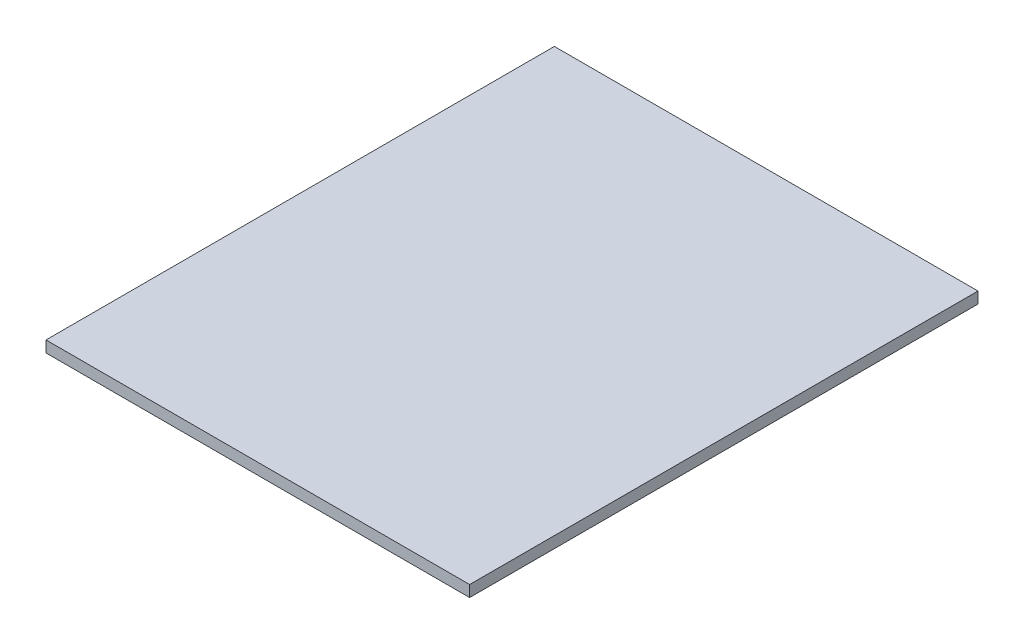
ISO-10303-21;
HEADER;
FILE_DESCRIPTION(('STEP AP214'),'2;1');
FILE_NAME('part.step','',(''),(''),'','','');
FILE_SCHEMA(('AUTOMOTIVE_DESIGN { 1 0 10303 214 1 1 1 1 }'));
ENDSEC;
DATA;
#1=APPLICATION_CONTEXT('core data for automotive mechanical design processes');
#2=APPLICATION_PROTOCOL_DEFINITION('international standard','automotive_design',2000,#1);
#3=PRODUCT_CONTEXT('',#1,'mechanical');
#4=PRODUCT('Part','Part','',(#3));
#5=PRODUCT_RELATED_PRODUCT_CATEGORY('part','',(#4));
#6=PRODUCT_DEFINITION_FORMATION('','',#4);
#7=PRODUCT_DEFINITION_CONTEXT('part definition',#1,'design');
#8=PRODUCT_DEFINITION('design','',#6,#7);
#9=PRODUCT_DEFINITION_SHAPE('','',#8);
#10=(LENGTH_UNIT() NAMED_UNIT(*) SI_UNIT(.MILLI.,.METRE.));
#11=(NAMED_UNIT(*) PLANE_ANGLE_UNIT() SI_UNIT($,.RADIAN.));
#12=(NAMED_UNIT(*) SI_UNIT($,.STERADIAN.) SOLID_ANGLE_UNIT());
#13=UNCERTAINTY_MEASURE_WITH_UNIT(LENGTH_MEASURE(1.E-05),#10,'distance_accuracy_value','');
#14=(GEOMETRIC_REPRESENTATION_CONTEXT(3) GLOBAL_UNCERTAINTY_ASSIGNED_CONTEXT((#13)) GLOBAL_UNIT_ASSIGNED_CONTEXT((#10,
#11,#12)) REPRESENTATION_CONTEXT('',''));
#15=CARTESIAN_POINT('',(0.,0.,0.));
#16=DIRECTION('',(0.,0.,1.));
#17=DIRECTION('',(1.,0.,0.));
#18=AXIS2_PLACEMENT_3D('',#15,#16,#17);
#19=CARTESIAN_POINT('',(-47.625,2.54,57.15));
#20=DIRECTION('',(1.,0.,0.));
#21=DIRECTION('',(0.,0.,-1.));
#22=AXIS2_PLACEMENT_3D('',#19,#20,#21);
#23=PLANE('',#22);
#24=DIRECTION('',(0.,0.,1.));
#25=VECTOR('',#24,1.);
#26=CARTESIAN_POINT('',(-47.625,0.,57.15));
#27=LINE('',#26,#25);
#28=CARTESIAN_POINT('',(-47.625,0.,-57.15));
#29=VERTEX_POINT('',#28);
#30=CARTESIAN_POINT('',(-47.625,0.,57.15));
#31=VERTEX_POINT('',#30);
#32=EDGE_CURVE('E96',#29,#31,#27,.T.);
#33=ORIENTED_EDGE('',*,*,#32,.T.);
#34=DIRECTION('',(0.,-1.,0.));
#35=VECTOR('',#34,1.);
#36=CARTESIAN_POINT('',(-47.625,2.54,57.15));
#37=LINE('',#36,#35);
#38=CARTESIAN_POINT('',(-47.625,2.54,57.15));
#39=VERTEX_POINT('',#38);
#40=EDGE_CURVE('E11',#39,#31,#37,.T.);
#41=ORIENTED_EDGE('',*,*,#40,.F.);
#42=DIRECTION('',(0.,0.,1.));
#43=VECTOR('',#42,1.);
#44=CARTESIAN_POINT('',(-47.625,2.54,57.15));
#45=LINE('',#44,#43);
#46=CARTESIAN_POINT('',(-47.625,2.54,-57.15));
#47=VERTEX_POINT('',#46);
#48=EDGE_CURVE('E84',#47,#39,#45,.T.);
#49=ORIENTED_EDGE('',*,*,#48,.F.);
#50=DIRECTION('',(0.,-1.,0.));
#51=VECTOR('',#50,1.);
#52=CARTESIAN_POINT('',(-47.625,2.54,-57.15));
#53=LINE('',#52,#51);
#54=EDGE_CURVE('E92',#47,#29,#53,.T.);
#55=ORIENTED_EDGE('',*,*,#54,.T.);
#56=EDGE_LOOP('',(#33,#41,#49,#55));
#57=FACE_BOUND('',#56,.T.);
#58=ADVANCED_FACE('F33',(#57),#23,.F.);
#59=CARTESIAN_POINT('',(47.625,2.54,57.15));
#60=DIRECTION('',(0.,0.,-1.));
#61=DIRECTION('',(-1.,0.,0.));
#62=AXIS2_PLACEMENT_3D('',#59,#60,#61);
#63=PLANE('',#62);
#64=DIRECTION('',(1.,0.,0.));
#65=VECTOR('',#64,1.);
#66=CARTESIAN_POINT('',(47.625,0.,57.15));
#67=LINE('',#66,#65);
#68=CARTESIAN_POINT('',(47.625,0.,57.15));
#69=VERTEX_POINT('',#68);
#70=EDGE_CURVE('E88',#31,#69,#67,.T.);
#71=ORIENTED_EDGE('',*,*,#70,.T.);
#72=DIRECTION('',(0.,-1.,0.));
#73=VECTOR('',#72,1.);
#74=CARTESIAN_POINT('',(47.625,2.54,57.15));
#75=LINE('',#74,#73);
#76=CARTESIAN_POINT('',(47.625,2.54,57.15));
#77=VERTEX_POINT('',#76);
#78=EDGE_CURVE('E41',#77,#69,#75,.T.);
#79=ORIENTED_EDGE('',*,*,#78,.F.);
#80=DIRECTION('',(1.,0.,0.));
#81=VECTOR('',#80,1.);
#82=CARTESIAN_POINT('',(47.625,2.54,57.15));
#83=LINE('',#82,#81);
#84=EDGE_CURVE('E79',#39,#77,#83,.T.);
#85=ORIENTED_EDGE('',*,*,#84,.F.);
#86=ORIENTED_EDGE('',*,*,#40,.T.);
#87=EDGE_LOOP('',(#71,#79,#85,#86));
#88=FACE_BOUND('',#87,.T.);
#89=ADVANCED_FACE('F87',(#88),#63,.F.);
#90=CARTESIAN_POINT('',(47.625,2.54,57.15));
#91=DIRECTION('',(-1.,0.,0.));
#92=DIRECTION('',(0.,0.,1.));
#93=AXIS2_PLACEMENT_3D('',#90,#91,#92);
#94=PLANE('',#93);
#95=DIRECTION('',(0.,0.,-1.));
#96=VECTOR('',#95,1.);
#97=CARTESIAN_POINT('',(47.625,0.,57.15));
#98=LINE('',#97,#96);
#99=CARTESIAN_POINT('',(47.625,0.,-57.15));
#100=VERTEX_POINT('',#99);
#101=EDGE_CURVE('E66',#69,#100,#98,.T.);
#102=ORIENTED_EDGE('',*,*,#101,.T.);
#103=DIRECTION('',(0.,-1.,0.));
#104=VECTOR('',#103,1.);
#105=CARTESIAN_POINT('',(47.625,2.54,-57.15));
#106=LINE('',#105,#104);
#107=CARTESIAN_POINT('',(47.625,2.54,-57.15));
#108=VERTEX_POINT('',#107);
#109=EDGE_CURVE('E89',#108,#100,#106,.T.);
#110=ORIENTED_EDGE('',*,*,#109,.F.);
#111=DIRECTION('',(0.,0.,-1.));
#112=VECTOR('',#111,1.);
#113=CARTESIAN_POINT('',(47.625,2.54,57.15));
#114=LINE('',#113,#112);
#115=EDGE_CURVE('E82',#77,#108,#114,.T.);
#116=ORIENTED_EDGE('',*,*,#115,.F.);
#117=ORIENTED_EDGE('',*,*,#78,.T.);
#118=EDGE_LOOP('',(#102,#110,#116,#117));
#119=FACE_BOUND('',#118,.T.);
#120=ADVANCED_FACE('F90',(#119),#94,.F.);
#121=CARTESIAN_POINT('',(47.625,2.54,-57.15));
#122=DIRECTION('',(0.,0.,1.));
#123=DIRECTION('',(1.,0.,0.));
#124=AXIS2_PLACEMENT_3D('',#121,#122,#123);
#125=PLANE('',#124);
#126=DIRECTION('',(-1.,0.,0.));
#127=VECTOR('',#126,1.);
#128=CARTESIAN_POINT('',(47.625,0.,-57.15));
#129=LINE('',#128,#127);
#130=EDGE_CURVE('E72',#100,#29,#129,.T.);
#131=ORIENTED_EDGE('',*,*,#130,.T.);
#132=ORIENTED_EDGE('',*,*,#54,.F.);
#133=DIRECTION('',(-1.,0.,0.));
#134=VECTOR('',#133,1.);
#135=CARTESIAN_POINT('',(47.625,2.54,-57.15));
#136=LINE('',#135,#134);
#137=EDGE_CURVE('E49',#108,#47,#136,.T.);
#138=ORIENTED_EDGE('',*,*,#137,.F.);
#139=ORIENTED_EDGE('',*,*,#109,.T.);
#140=EDGE_LOOP('',(#131,#132,#138,#139));
#141=FACE_BOUND('',#140,.T.);
#142=ADVANCED_FACE('F103',(#141),#125,.F.);
#143=CARTESIAN_POINT('',(0.,2.54,0.));
#144=DIRECTION('',(0.,1.,0.));
#145=DIRECTION('',(0.,0.,1.));
#146=AXIS2_PLACEMENT_3D('',#143,#144,#145);
#147=PLANE('',#146);
#148=ORIENTED_EDGE('',*,*,#48,.T.);
#149=ORIENTED_EDGE('',*,*,#84,.T.);
#150=ORIENTED_EDGE('',*,*,#115,.T.);
#151=ORIENTED_EDGE('',*,*,#137,.T.);
#152=EDGE_LOOP('',(#148,#149,#150,#151));
#153=FACE_BOUND('',#152,.T.);
#154=ADVANCED_FACE('F80',(#153),#147,.T.);
#155=CARTESIAN_POINT('',(0.,0.,0.));
#156=DIRECTION('',(0.,1.,0.));
#157=DIRECTION('',(0.,0.,1.));
#158=AXIS2_PLACEMENT_3D('',#155,#156,#157);
#159=PLANE('',#158);
#160=ORIENTED_EDGE('',*,*,#32,.F.);
#161=ORIENTED_EDGE('',*,*,#130,.F.);
#162=ORIENTED_EDGE('',*,*,#101,.F.);
#163=ORIENTED_EDGE('',*,*,#70,.F.);
#164=EDGE_LOOP('',(#160,#161,#162,#163));
#165=FACE_BOUND('',#164,.T.);
#166=ADVANCED_FACE('F106',(#165),#159,.F.);
#167=CLOSED_SHELL('',(#58,#89,#120,#142,#154,#166));
#168=MANIFOLD_SOLID_BREP('B2',#167);
#169=ADVANCED_BREP_SHAPE_REPRESENTATION('',(#18,#168),#14);
#170=SHAPE_DEFINITION_REPRESENTATION(#9,#169);
ENDSEC;
END-ISO-10303-21;
